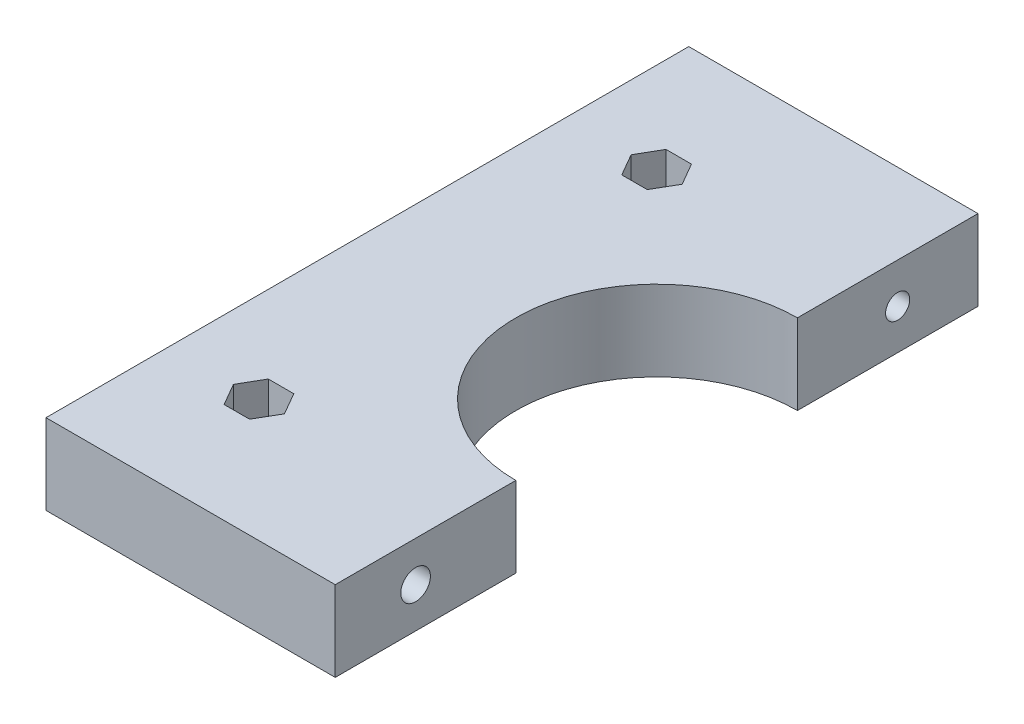
ISO-10303-21;
HEADER;
FILE_DESCRIPTION(('STEP AP214'),'2;1');
FILE_NAME('part.step','',(''),(''),'','','');
FILE_SCHEMA(('AUTOMOTIVE_DESIGN { 1 0 10303 214 1 1 1 1 }'));
ENDSEC;
DATA;
#1=APPLICATION_CONTEXT('core data for automotive mechanical design processes');
#2=APPLICATION_PROTOCOL_DEFINITION('international standard','automotive_design',2000,#1);
#3=PRODUCT_CONTEXT('',#1,'mechanical');
#4=PRODUCT('Part','Part','',(#3));
#5=PRODUCT_RELATED_PRODUCT_CATEGORY('part','',(#4));
#6=PRODUCT_DEFINITION_FORMATION('','',#4);
#7=PRODUCT_DEFINITION_CONTEXT('part definition',#1,'design');
#8=PRODUCT_DEFINITION('design','',#6,#7);
#9=PRODUCT_DEFINITION_SHAPE('','',#8);
#10=(LENGTH_UNIT() NAMED_UNIT(*) SI_UNIT(.MILLI.,.METRE.));
#11=(NAMED_UNIT(*) PLANE_ANGLE_UNIT() SI_UNIT($,.RADIAN.));
#12=(NAMED_UNIT(*) SI_UNIT($,.STERADIAN.) SOLID_ANGLE_UNIT());
#13=UNCERTAINTY_MEASURE_WITH_UNIT(LENGTH_MEASURE(1.E-05),#10,'distance_accuracy_value','');
#14=(GEOMETRIC_REPRESENTATION_CONTEXT(3) GLOBAL_UNCERTAINTY_ASSIGNED_CONTEXT((#13)) GLOBAL_UNIT_ASSIGNED_CONTEXT((#10,
#11,#12)) REPRESENTATION_CONTEXT('',''));
#15=CARTESIAN_POINT('',(0.,0.,0.));
#16=DIRECTION('',(0.,0.,1.));
#17=DIRECTION('',(1.,0.,0.));
#18=AXIS2_PLACEMENT_3D('',#15,#16,#17);
#19=CARTESIAN_POINT('',(-24.7487373415295,-5.,24.7487373415289));
#20=DIRECTION('',(0.,1.,0.));
#21=DIRECTION('',(0.,0.,1.));
#22=AXIS2_PLACEMENT_3D('',#19,#20,#21);
#23=CYLINDRICAL_SURFACE('',#22,1.5);
#24=CARTESIAN_POINT('',(-24.7487373415295,-5.,24.7487373415289));
#25=DIRECTION('',(0.,1.,0.));
#26=DIRECTION('',(0.,0.,1.));
#27=AXIS2_PLACEMENT_3D('',#24,#25,#26);
#28=CIRCLE('',#27,1.5);
#29=CARTESIAN_POINT('',(-24.7487373415295,-5.,26.2487373415289));
#30=VERTEX_POINT('',#29);
#31=EDGE_CURVE('E464',#30,#30,#28,.T.);
#32=ORIENTED_EDGE('',*,*,#31,.F.);
#33=EDGE_LOOP('',(#32));
#34=FACE_BOUND('',#33,.T.);
#35=CARTESIAN_POINT('',(-24.7487373415295,0.,24.7487373415289));
#36=DIRECTION('',(0.,1.,0.));
#37=DIRECTION('',(0.,0.,1.));
#38=AXIS2_PLACEMENT_3D('',#35,#36,#37);
#39=CIRCLE('',#38,1.5);
#40=CARTESIAN_POINT('',(-24.7487373415295,0.,26.2487373415289));
#41=VERTEX_POINT('',#40);
#42=EDGE_CURVE('E337',#41,#41,#39,.F.);
#43=ORIENTED_EDGE('',*,*,#42,.F.);
#44=EDGE_LOOP('',(#43));
#45=FACE_BOUND('',#44,.T.);
#46=ADVANCED_FACE('F47',(#34,#45),#23,.F.);
#47=CARTESIAN_POINT('',(0.,5.,0.));
#48=DIRECTION('',(0.,1.,0.));
#49=DIRECTION('',(0.,0.,1.));
#50=AXIS2_PLACEMENT_3D('',#47,#48,#49);
#51=PLANE('',#50);
#52=DIRECTION('',(1.,0.,0.));
#53=VECTOR('',#52,1.);
#54=CARTESIAN_POINT('',(0.,5.,-40.));
#55=LINE('',#54,#53);
#56=CARTESIAN_POINT('',(-36.,5.,-40.));
#57=VERTEX_POINT('',#56);
#58=CARTESIAN_POINT('',(2.79318507107451E-13,5.,-40.));
#59=VERTEX_POINT('',#58);
#60=EDGE_CURVE('E420',#57,#59,#55,.T.);
#61=ORIENTED_EDGE('',*,*,#60,.F.);
#62=DIRECTION('',(0.,0.,-1.));
#63=VECTOR('',#62,1.);
#64=CARTESIAN_POINT('',(-36.,5.,0.));
#65=LINE('',#64,#63);
#66=CARTESIAN_POINT('',(-36.,5.,40.));
#67=VERTEX_POINT('',#66);
#68=EDGE_CURVE('E424',#67,#57,#65,.T.);
#69=ORIENTED_EDGE('',*,*,#68,.F.);
#70=DIRECTION('',(1.,0.,0.));
#71=VECTOR('',#70,1.);
#72=CARTESIAN_POINT('',(0.,5.,40.));
#73=LINE('',#72,#71);
#74=CARTESIAN_POINT('',(-2.79318507107451E-13,5.,40.));
#75=VERTEX_POINT('',#74);
#76=EDGE_CURVE('E428',#67,#75,#73,.T.);
#77=ORIENTED_EDGE('',*,*,#76,.T.);
#78=DIRECTION('',(0.,0.,1.));
#79=VECTOR('',#78,1.);
#80=CARTESIAN_POINT('',(0.,5.,0.));
#81=LINE('',#80,#79);
#82=CARTESIAN_POINT('',(-1.22376420926452E-13,5.,17.525));
#83=VERTEX_POINT('',#82);
#84=EDGE_CURVE('E432',#83,#75,#81,.T.);
#85=ORIENTED_EDGE('',*,*,#84,.F.);
#86=CARTESIAN_POINT('',(0.,5.,0.));
#87=DIRECTION('',(0.,1.,0.));
#88=DIRECTION('',(0.,0.,1.));
#89=AXIS2_PLACEMENT_3D('',#86,#87,#88);
#90=CIRCLE('',#89,17.525);
#91=CARTESIAN_POINT('',(1.22376420926452E-13,5.,-17.525));
#92=VERTEX_POINT('',#91);
#93=EDGE_CURVE('E436',#92,#83,#90,.T.);
#94=ORIENTED_EDGE('',*,*,#93,.F.);
#95=DIRECTION('',(0.,0.,1.));
#96=VECTOR('',#95,1.);
#97=CARTESIAN_POINT('',(0.,5.,0.));
#98=LINE('',#97,#96);
#99=EDGE_CURVE('E440',#59,#92,#98,.T.);
#100=ORIENTED_EDGE('',*,*,#99,.F.);
#101=EDGE_LOOP('',(#61,#69,#77,#85,#94,#100));
#102=FACE_BOUND('',#101,.T.);
#103=DIRECTION('',(-0.500000000000006,0.,-0.866025403784435));
#104=VECTOR('',#103,1.);
#105=CARTESIAN_POINT('',(-21.5733108609859,5.,-24.7487373415295));
#106=LINE('',#105,#104);
#107=CARTESIAN_POINT('',(-21.5733108609859,5.,-24.7487373415295));
#108=VERTEX_POINT('',#107);
#109=CARTESIAN_POINT('',(-23.1610241012574,5.,-27.4987373415295));
#110=VERTEX_POINT('',#109);
#111=EDGE_CURVE('E379',#108,#110,#106,.T.);
#112=ORIENTED_EDGE('',*,*,#111,.F.);
#113=DIRECTION('',(0.499999999999994,0.,-0.866025403784442));
#114=VECTOR('',#113,1.);
#115=CARTESIAN_POINT('',(-23.1610241012574,5.,-21.9987373415295));
#116=LINE('',#115,#114);
#117=CARTESIAN_POINT('',(-23.1610241012574,5.,-21.9987373415295));
#118=VERTEX_POINT('',#117);
#119=EDGE_CURVE('E358',#118,#108,#116,.T.);
#120=ORIENTED_EDGE('',*,*,#119,.F.);
#121=DIRECTION('',(1.,0.,0.));
#122=VECTOR('',#121,1.);
#123=CARTESIAN_POINT('',(-26.3364505818003,5.,-21.9987373415295));
#124=LINE('',#123,#122);
#125=CARTESIAN_POINT('',(-26.3364505818003,5.,-21.9987373415295));
#126=VERTEX_POINT('',#125);
#127=EDGE_CURVE('E394',#126,#118,#124,.T.);
#128=ORIENTED_EDGE('',*,*,#127,.F.);
#129=DIRECTION('',(0.500000000000007,0.,0.866025403784435));
#130=VECTOR('',#129,1.);
#131=CARTESIAN_POINT('',(-27.9241638220718,5.,-24.7487373415294));
#132=LINE('',#131,#130);
#133=CARTESIAN_POINT('',(-27.9241638220718,5.,-24.7487373415294));
#134=VERTEX_POINT('',#133);
#135=EDGE_CURVE('E390',#134,#126,#132,.T.);
#136=ORIENTED_EDGE('',*,*,#135,.F.);
#137=DIRECTION('',(-0.499999999999994,0.,0.866025403784442));
#138=VECTOR('',#137,1.);
#139=CARTESIAN_POINT('',(-26.3364505818004,5.,-27.4987373415295));
#140=LINE('',#139,#138);
#141=CARTESIAN_POINT('',(-26.3364505818004,5.,-27.4987373415295));
#142=VERTEX_POINT('',#141);
#143=EDGE_CURVE('E386',#142,#134,#140,.T.);
#144=ORIENTED_EDGE('',*,*,#143,.F.);
#145=DIRECTION('',(-1.,0.,0.));
#146=VECTOR('',#145,1.);
#147=CARTESIAN_POINT('',(-23.1610241012574,5.,-27.4987373415295));
#148=LINE('',#147,#146);
#149=EDGE_CURVE('E382',#110,#142,#148,.T.);
#150=ORIENTED_EDGE('',*,*,#149,.F.);
#151=EDGE_LOOP('',(#112,#120,#128,#136,#144,#150));
#152=FACE_BOUND('',#151,.T.);
#153=DIRECTION('',(0.499999999999994,0.,0.866025403784442));
#154=VECTOR('',#153,1.);
#155=CARTESIAN_POINT('',(-23.1610241012574,5.,21.9987373415295));
#156=LINE('',#155,#154);
#157=CARTESIAN_POINT('',(-23.1610241012574,5.,21.9987373415295));
#158=VERTEX_POINT('',#157);
#159=CARTESIAN_POINT('',(-21.5733108609859,5.,24.7487373415295));
#160=VERTEX_POINT('',#159);
#161=EDGE_CURVE('E315',#158,#160,#156,.T.);
#162=ORIENTED_EDGE('',*,*,#161,.T.);
#163=DIRECTION('',(-0.500000000000006,0.,0.866025403784435));
#164=VECTOR('',#163,1.);
#165=CARTESIAN_POINT('',(-21.5733108609859,5.,24.7487373415295));
#166=LINE('',#165,#164);
#167=CARTESIAN_POINT('',(-23.1610241012574,5.,27.4987373415295));
#168=VERTEX_POINT('',#167);
#169=EDGE_CURVE('E293',#160,#168,#166,.T.);
#170=ORIENTED_EDGE('',*,*,#169,.T.);
#171=DIRECTION('',(-1.,0.,0.));
#172=VECTOR('',#171,1.);
#173=CARTESIAN_POINT('',(-23.1610241012574,5.,27.4987373415295));
#174=LINE('',#173,#172);
#175=CARTESIAN_POINT('',(-26.3364505818004,5.,27.4987373415295));
#176=VERTEX_POINT('',#175);
#177=EDGE_CURVE('E299',#168,#176,#174,.T.);
#178=ORIENTED_EDGE('',*,*,#177,.T.);
#179=DIRECTION('',(-0.499999999999994,0.,-0.866025403784442));
#180=VECTOR('',#179,1.);
#181=CARTESIAN_POINT('',(-26.3364505818004,5.,27.4987373415295));
#182=LINE('',#181,#180);
#183=CARTESIAN_POINT('',(-27.9241638220718,5.,24.7487373415294));
#184=VERTEX_POINT('',#183);
#185=EDGE_CURVE('E327',#176,#184,#182,.T.);
#186=ORIENTED_EDGE('',*,*,#185,.T.);
#187=DIRECTION('',(0.500000000000007,0.,-0.866025403784435));
#188=VECTOR('',#187,1.);
#189=CARTESIAN_POINT('',(-27.9241638220718,5.,24.7487373415294));
#190=LINE('',#189,#188);
#191=CARTESIAN_POINT('',(-26.3364505818003,5.,21.9987373415295));
#192=VERTEX_POINT('',#191);
#193=EDGE_CURVE('E323',#184,#192,#190,.T.);
#194=ORIENTED_EDGE('',*,*,#193,.T.);
#195=DIRECTION('',(1.,0.,0.));
#196=VECTOR('',#195,1.);
#197=CARTESIAN_POINT('',(-26.3364505818003,5.,21.9987373415295));
#198=LINE('',#197,#196);
#199=EDGE_CURVE('E319',#192,#158,#198,.T.);
#200=ORIENTED_EDGE('',*,*,#199,.T.);
#201=EDGE_LOOP('',(#162,#170,#178,#186,#194,#200));
#202=FACE_BOUND('',#201,.T.);
#203=ADVANCED_FACE('F581',(#102,#152,#202),#51,.T.);
#204=CARTESIAN_POINT('',(-24.7487373415289,-5.,-24.7487373415295));
#205=DIRECTION('',(0.,1.,0.));
#206=DIRECTION('',(0.,0.,1.));
#207=AXIS2_PLACEMENT_3D('',#204,#205,#206);
#208=CYLINDRICAL_SURFACE('',#207,1.5);
#209=CARTESIAN_POINT('',(-24.7487373415289,-5.,-24.7487373415295));
#210=DIRECTION('',(0.,1.,0.));
#211=DIRECTION('',(0.,0.,1.));
#212=AXIS2_PLACEMENT_3D('',#209,#210,#211);
#213=CIRCLE('',#212,1.5);
#214=CARTESIAN_POINT('',(-24.7487373415289,-5.,-23.2487373415295));
#215=VERTEX_POINT('',#214);
#216=EDGE_CURVE('E468',#215,#215,#213,.T.);
#217=ORIENTED_EDGE('',*,*,#216,.F.);
#218=EDGE_LOOP('',(#217));
#219=FACE_BOUND('',#218,.T.);
#220=CARTESIAN_POINT('',(-24.7487373415289,0.,-24.7487373415295));
#221=DIRECTION('',(0.,1.,0.));
#222=DIRECTION('',(0.,0.,1.));
#223=AXIS2_PLACEMENT_3D('',#220,#221,#222);
#224=CIRCLE('',#223,1.5);
#225=CARTESIAN_POINT('',(-24.7487373415289,0.,-23.2487373415295));
#226=VERTEX_POINT('',#225);
#227=EDGE_CURVE('E404',#226,#226,#224,.F.);
#228=ORIENTED_EDGE('',*,*,#227,.F.);
#229=EDGE_LOOP('',(#228));
#230=FACE_BOUND('',#229,.T.);
#231=ADVANCED_FACE('F588',(#219,#230),#208,.F.);
#232=CARTESIAN_POINT('',(0.,-5.,-40.));
#233=DIRECTION('',(0.,0.,1.));
#234=DIRECTION('',(1.,0.,0.));
#235=AXIS2_PLACEMENT_3D('',#232,#233,#234);
#236=PLANE('',#235);
#237=DIRECTION('',(0.,1.,0.));
#238=VECTOR('',#237,1.);
#239=CARTESIAN_POINT('',(-36.,-5.,-40.));
#240=LINE('',#239,#238);
#241=CARTESIAN_POINT('',(-36.,-5.,-40.));
#242=VERTEX_POINT('',#241);
#243=EDGE_CURVE('E472',#242,#57,#240,.T.);
#244=ORIENTED_EDGE('',*,*,#243,.T.);
#245=ORIENTED_EDGE('',*,*,#60,.T.);
#246=DIRECTION('',(0.,1.,0.));
#247=VECTOR('',#246,1.);
#248=CARTESIAN_POINT('',(2.79318507107451E-13,-5.,-40.));
#249=LINE('',#248,#247);
#250=CARTESIAN_POINT('',(2.79318507107451E-13,-5.,-40.));
#251=VERTEX_POINT('',#250);
#252=EDGE_CURVE('E473',#251,#59,#249,.T.);
#253=ORIENTED_EDGE('',*,*,#252,.F.);
#254=DIRECTION('',(1.,0.,0.));
#255=VECTOR('',#254,1.);
#256=CARTESIAN_POINT('',(0.,-5.,-40.));
#257=LINE('',#256,#255);
#258=EDGE_CURVE('E444',#242,#251,#257,.T.);
#259=ORIENTED_EDGE('',*,*,#258,.F.);
#260=EDGE_LOOP('',(#244,#245,#253,#259));
#261=FACE_BOUND('',#260,.T.);
#262=ADVANCED_FACE('F49',(#261),#236,.F.);
#263=CARTESIAN_POINT('',(0.,-5.,0.));
#264=DIRECTION('',(-1.,0.,0.));
#265=DIRECTION('',(0.,0.,1.));
#266=AXIS2_PLACEMENT_3D('',#263,#264,#265);
#267=PLANE('',#266);
#268=CARTESIAN_POINT('',(2.09901540593194E-13,0.,-30.));
#269=DIRECTION('',(-1.,0.,0.));
#270=DIRECTION('',(0.,0.,1.));
#271=AXIS2_PLACEMENT_3D('',#268,#269,#270);
#272=CIRCLE('',#271,1.5);
#273=CARTESIAN_POINT('',(1.99427096576664E-13,0.,-28.5));
#274=VERTEX_POINT('',#273);
#275=EDGE_CURVE('E500',#274,#274,#272,.T.);
#276=ORIENTED_EDGE('',*,*,#275,.T.);
#277=EDGE_LOOP('',(#276));
#278=FACE_BOUND('',#277,.T.);
#279=ORIENTED_EDGE('',*,*,#252,.T.);
#280=ORIENTED_EDGE('',*,*,#99,.T.);
#281=DIRECTION('',(0.,1.,0.));
#282=VECTOR('',#281,1.);
#283=CARTESIAN_POINT('',(1.22376420926452E-13,-5.,-17.525));
#284=LINE('',#283,#282);
#285=CARTESIAN_POINT('',(1.22376420926452E-13,-5.,-17.525));
#286=VERTEX_POINT('',#285);
#287=EDGE_CURVE('E476',#286,#92,#284,.T.);
#288=ORIENTED_EDGE('',*,*,#287,.F.);
#289=DIRECTION('',(0.,0.,1.));
#290=VECTOR('',#289,1.);
#291=CARTESIAN_POINT('',(0.,-5.,0.));
#292=LINE('',#291,#290);
#293=EDGE_CURVE('E461',#251,#286,#292,.T.);
#294=ORIENTED_EDGE('',*,*,#293,.F.);
#295=EDGE_LOOP('',(#279,#280,#288,#294));
#296=FACE_BOUND('',#295,.T.);
#297=ADVANCED_FACE('F596',(#278,#296),#267,.F.);
#298=CARTESIAN_POINT('',(0.,-5.,0.));
#299=DIRECTION('',(0.,1.,0.));
#300=DIRECTION('',(0.,0.,1.));
#301=AXIS2_PLACEMENT_3D('',#298,#299,#300);
#302=CYLINDRICAL_SURFACE('',#301,17.525);
#303=ORIENTED_EDGE('',*,*,#287,.T.);
#304=ORIENTED_EDGE('',*,*,#93,.T.);
#305=DIRECTION('',(0.,1.,0.));
#306=VECTOR('',#305,1.);
#307=CARTESIAN_POINT('',(-1.22376420926452E-13,-5.,17.525));
#308=LINE('',#307,#306);
#309=CARTESIAN_POINT('',(-1.22376420926452E-13,-5.,17.525));
#310=VERTEX_POINT('',#309);
#311=EDGE_CURVE('E479',#310,#83,#308,.T.);
#312=ORIENTED_EDGE('',*,*,#311,.F.);
#313=CARTESIAN_POINT('',(0.,-5.,0.));
#314=DIRECTION('',(0.,1.,0.));
#315=DIRECTION('',(0.,0.,1.));
#316=AXIS2_PLACEMENT_3D('',#313,#314,#315);
#317=CIRCLE('',#316,17.525);
#318=EDGE_CURVE('E458',#286,#310,#317,.T.);
#319=ORIENTED_EDGE('',*,*,#318,.F.);
#320=EDGE_LOOP('',(#303,#304,#312,#319));
#321=FACE_BOUND('',#320,.T.);
#322=ADVANCED_FACE('F599',(#321),#302,.F.);
#323=CARTESIAN_POINT('',(0.,-5.,0.));
#324=DIRECTION('',(-1.,0.,0.));
#325=DIRECTION('',(0.,0.,1.));
#326=AXIS2_PLACEMENT_3D('',#323,#324,#325);
#327=PLANE('',#326);
#328=CARTESIAN_POINT('',(-2.09901540593194E-13,0.,30.));
#329=DIRECTION('',(-1.,0.,0.));
#330=DIRECTION('',(0.,0.,1.));
#331=AXIS2_PLACEMENT_3D('',#328,#329,#330);
#332=CIRCLE('',#331,1.84326133668046);
#333=CARTESIAN_POINT('',(-2.22772965712455E-13,0.,31.8432613366805));
#334=VERTEX_POINT('',#333);
#335=EDGE_CURVE('E230',#334,#334,#332,.T.);
#336=ORIENTED_EDGE('',*,*,#335,.T.);
#337=EDGE_LOOP('',(#336));
#338=FACE_BOUND('',#337,.T.);
#339=ORIENTED_EDGE('',*,*,#311,.T.);
#340=ORIENTED_EDGE('',*,*,#84,.T.);
#341=DIRECTION('',(0.,1.,0.));
#342=VECTOR('',#341,1.);
#343=CARTESIAN_POINT('',(-2.79318507107451E-13,-5.,40.));
#344=LINE('',#343,#342);
#345=CARTESIAN_POINT('',(-2.79318507107451E-13,-5.,40.));
#346=VERTEX_POINT('',#345);
#347=EDGE_CURVE('E482',#346,#75,#344,.T.);
#348=ORIENTED_EDGE('',*,*,#347,.F.);
#349=DIRECTION('',(0.,0.,1.));
#350=VECTOR('',#349,1.);
#351=CARTESIAN_POINT('',(0.,-5.,0.));
#352=LINE('',#351,#350);
#353=EDGE_CURVE('E455',#310,#346,#352,.T.);
#354=ORIENTED_EDGE('',*,*,#353,.F.);
#355=EDGE_LOOP('',(#339,#340,#348,#354));
#356=FACE_BOUND('',#355,.T.);
#357=ADVANCED_FACE('F602',(#338,#356),#327,.F.);
#358=CARTESIAN_POINT('',(0.,-5.,40.));
#359=DIRECTION('',(0.,0.,1.));
#360=DIRECTION('',(1.,0.,0.));
#361=AXIS2_PLACEMENT_3D('',#358,#359,#360);
#362=PLANE('',#361);
#363=ORIENTED_EDGE('',*,*,#347,.T.);
#364=ORIENTED_EDGE('',*,*,#76,.F.);
#365=DIRECTION('',(0.,1.,0.));
#366=VECTOR('',#365,1.);
#367=CARTESIAN_POINT('',(-36.,-5.,40.));
#368=LINE('',#367,#366);
#369=CARTESIAN_POINT('',(-36.,-5.,40.));
#370=VERTEX_POINT('',#369);
#371=EDGE_CURVE('E485',#370,#67,#368,.T.);
#372=ORIENTED_EDGE('',*,*,#371,.F.);
#373=DIRECTION('',(1.,0.,0.));
#374=VECTOR('',#373,1.);
#375=CARTESIAN_POINT('',(0.,-5.,40.));
#376=LINE('',#375,#374);
#377=EDGE_CURVE('E451',#370,#346,#376,.T.);
#378=ORIENTED_EDGE('',*,*,#377,.T.);
#379=EDGE_LOOP('',(#363,#364,#372,#378));
#380=FACE_BOUND('',#379,.T.);
#381=ADVANCED_FACE('F606',(#380),#362,.T.);
#382=CARTESIAN_POINT('',(-36.,-5.,0.));
#383=DIRECTION('',(1.,0.,0.));
#384=DIRECTION('',(0.,0.,-1.));
#385=AXIS2_PLACEMENT_3D('',#382,#383,#384);
#386=PLANE('',#385);
#387=CARTESIAN_POINT('',(-36.,0.,-30.));
#388=DIRECTION('',(-1.,0.,0.));
#389=DIRECTION('',(0.,0.,1.));
#390=AXIS2_PLACEMENT_3D('',#387,#388,#389);
#391=CIRCLE('',#390,2.5);
#392=CARTESIAN_POINT('',(-36.,0.,-27.5));
#393=VERTEX_POINT('',#392);
#394=EDGE_CURVE('E248',#393,#393,#391,.T.);
#395=ORIENTED_EDGE('',*,*,#394,.F.);
#396=EDGE_LOOP('',(#395));
#397=FACE_BOUND('',#396,.T.);
#398=DIRECTION('',(0.,0.00176809729575302,-0.999998436914755));
#399=VECTOR('',#398,1.);
#400=CARTESIAN_POINT('',(-36.,2.74749068907875,31.5925730261037));
#401=LINE('',#400,#399);
#402=CARTESIAN_POINT('',(-36.,2.74749068907875,31.5925730261037));
#403=VERTEX_POINT('',#402);
#404=CARTESIAN_POINT('',(-36.,2.75310515205186,28.417151509023));
#405=VERTEX_POINT('',#404);
#406=EDGE_CURVE('E246',#403,#405,#401,.T.);
#407=ORIENTED_EDGE('',*,*,#406,.F.);
#408=DIRECTION('',(0.,0.866908098760784,-0.498468001282894));
#409=VECTOR('',#408,1.);
#410=CARTESIAN_POINT('',(-36.,-0.00531224392338013,33.1754215170807));
#411=LINE('',#410,#409);
#412=CARTESIAN_POINT('',(-36.,-0.00531224392338013,33.1754215170807));
#413=VERTEX_POINT('',#412);
#414=EDGE_CURVE('E65',#413,#403,#411,.T.);
#415=ORIENTED_EDGE('',*,*,#414,.F.);
#416=DIRECTION('',(0.,0.865140001465032,0.501530435631862));
#417=VECTOR('',#416,1.);
#418=CARTESIAN_POINT('',(-36.,-2.75250071395239,31.582848490977));
#419=LINE('',#418,#417);
#420=CARTESIAN_POINT('',(-36.,-2.75250071395239,31.582848490977));
#421=VERTEX_POINT('',#420);
#422=EDGE_CURVE('E233',#421,#413,#419,.T.);
#423=ORIENTED_EDGE('',*,*,#422,.F.);
#424=DIRECTION('',(0.,-0.00176809729575275,0.999998436914755));
#425=VECTOR('',#424,1.);
#426=CARTESIAN_POINT('',(-36.,-2.74688625097928,28.4074269738964));
#427=LINE('',#426,#425);
#428=CARTESIAN_POINT('',(-36.,-2.74688625097928,28.4074269738964));
#429=VERTEX_POINT('',#428);
#430=EDGE_CURVE('E239',#429,#421,#427,.T.);
#431=ORIENTED_EDGE('',*,*,#430,.F.);
#432=DIRECTION('',(0.,-0.866908098760785,0.498468001282893));
#433=VECTOR('',#432,1.);
#434=CARTESIAN_POINT('',(-36.,0.00591668202284783,26.8245784829193));
#435=LINE('',#434,#433);
#436=CARTESIAN_POINT('',(-36.,0.00591668202284783,26.8245784829193));
#437=VERTEX_POINT('',#436);
#438=EDGE_CURVE('E533',#437,#429,#435,.T.);
#439=ORIENTED_EDGE('',*,*,#438,.F.);
#440=DIRECTION('',(0.,-0.865140001465032,-0.501530435631862));
#441=VECTOR('',#440,1.);
#442=CARTESIAN_POINT('',(-36.,2.75310515205186,28.417151509023));
#443=LINE('',#442,#441);
#444=EDGE_CURVE('E255',#405,#437,#443,.T.);
#445=ORIENTED_EDGE('',*,*,#444,.F.);
#446=EDGE_LOOP('',(#407,#415,#423,#431,#439,#445));
#447=FACE_BOUND('',#446,.T.);
#448=ORIENTED_EDGE('',*,*,#371,.T.);
#449=ORIENTED_EDGE('',*,*,#68,.T.);
#450=ORIENTED_EDGE('',*,*,#243,.F.);
#451=DIRECTION('',(0.,0.,-1.));
#452=VECTOR('',#451,1.);
#453=CARTESIAN_POINT('',(-36.,-5.,0.));
#454=LINE('',#453,#452);
#455=EDGE_CURVE('E448',#370,#242,#454,.T.);
#456=ORIENTED_EDGE('',*,*,#455,.F.);
#457=EDGE_LOOP('',(#448,#449,#450,#456));
#458=FACE_BOUND('',#457,.T.);
#459=ADVANCED_FACE('F242',(#397,#447,#458),#386,.F.);
#460=CARTESIAN_POINT('',(0.,-5.,0.));
#461=DIRECTION('',(0.,1.,0.));
#462=DIRECTION('',(0.,0.,1.));
#463=AXIS2_PLACEMENT_3D('',#460,#461,#462);
#464=PLANE('',#463);
#465=ORIENTED_EDGE('',*,*,#258,.T.);
#466=ORIENTED_EDGE('',*,*,#293,.T.);
#467=ORIENTED_EDGE('',*,*,#318,.T.);
#468=ORIENTED_EDGE('',*,*,#353,.T.);
#469=ORIENTED_EDGE('',*,*,#377,.F.);
#470=ORIENTED_EDGE('',*,*,#455,.T.);
#471=EDGE_LOOP('',(#465,#466,#467,#468,#469,#470));
#472=FACE_BOUND('',#471,.T.);
#473=ORIENTED_EDGE('',*,*,#31,.T.);
#474=EDGE_LOOP('',(#473));
#475=FACE_BOUND('',#474,.T.);
#476=ORIENTED_EDGE('',*,*,#216,.T.);
#477=EDGE_LOOP('',(#476));
#478=FACE_BOUND('',#477,.T.);
#479=ADVANCED_FACE('F611',(#472,#475,#478),#464,.F.);
#480=CARTESIAN_POINT('',(0.,0.,0.));
#481=DIRECTION('',(0.,1.,0.));
#482=DIRECTION('',(0.,0.,1.));
#483=AXIS2_PLACEMENT_3D('',#480,#481,#482);
#484=PLANE('',#483);
#485=DIRECTION('',(-0.500000000000006,0.,-0.866025403784435));
#486=VECTOR('',#485,1.);
#487=CARTESIAN_POINT('',(-21.5733108609859,0.,-24.7487373415295));
#488=LINE('',#487,#486);
#489=CARTESIAN_POINT('',(-21.5733108609859,0.,-24.7487373415295));
#490=VERTEX_POINT('',#489);
#491=CARTESIAN_POINT('',(-23.1610241012574,0.,-27.4987373415295));
#492=VERTEX_POINT('',#491);
#493=EDGE_CURVE('E353',#490,#492,#488,.T.);
#494=ORIENTED_EDGE('',*,*,#493,.T.);
#495=DIRECTION('',(-1.,0.,0.));
#496=VECTOR('',#495,1.);
#497=CARTESIAN_POINT('',(-23.1610241012574,0.,-27.4987373415295));
#498=LINE('',#497,#496);
#499=CARTESIAN_POINT('',(-26.3364505818004,0.,-27.4987373415295));
#500=VERTEX_POINT('',#499);
#501=EDGE_CURVE('E357',#492,#500,#498,.T.);
#502=ORIENTED_EDGE('',*,*,#501,.T.);
#503=DIRECTION('',(-0.499999999999994,0.,0.866025403784442));
#504=VECTOR('',#503,1.);
#505=CARTESIAN_POINT('',(-26.3364505818004,0.,-27.4987373415295));
#506=LINE('',#505,#504);
#507=CARTESIAN_POINT('',(-27.9241638220718,0.,-24.7487373415294));
#508=VERTEX_POINT('',#507);
#509=EDGE_CURVE('E362',#500,#508,#506,.T.);
#510=ORIENTED_EDGE('',*,*,#509,.T.);
#511=DIRECTION('',(0.500000000000007,0.,0.866025403784435));
#512=VECTOR('',#511,1.);
#513=CARTESIAN_POINT('',(-27.9241638220718,0.,-24.7487373415294));
#514=LINE('',#513,#512);
#515=CARTESIAN_POINT('',(-26.3364505818003,0.,-21.9987373415295));
#516=VERTEX_POINT('',#515);
#517=EDGE_CURVE('E366',#508,#516,#514,.T.);
#518=ORIENTED_EDGE('',*,*,#517,.T.);
#519=DIRECTION('',(1.,0.,0.));
#520=VECTOR('',#519,1.);
#521=CARTESIAN_POINT('',(-26.3364505818003,0.,-21.9987373415295));
#522=LINE('',#521,#520);
#523=CARTESIAN_POINT('',(-23.1610241012574,0.,-21.9987373415295));
#524=VERTEX_POINT('',#523);
#525=EDGE_CURVE('E370',#516,#524,#522,.T.);
#526=ORIENTED_EDGE('',*,*,#525,.T.);
#527=DIRECTION('',(0.499999999999994,0.,-0.866025403784442));
#528=VECTOR('',#527,1.);
#529=CARTESIAN_POINT('',(-23.1610241012574,0.,-21.9987373415295));
#530=LINE('',#529,#528);
#531=EDGE_CURVE('E374',#524,#490,#530,.T.);
#532=ORIENTED_EDGE('',*,*,#531,.T.);
#533=EDGE_LOOP('',(#494,#502,#510,#518,#526,#532));
#534=FACE_BOUND('',#533,.T.);
#535=ORIENTED_EDGE('',*,*,#227,.T.);
#536=EDGE_LOOP('',(#535));
#537=FACE_BOUND('',#536,.T.);
#538=ADVANCED_FACE('F618',(#534,#537),#484,.T.);
#539=CARTESIAN_POINT('',(-21.5733108609859,0.,-24.7487373415295));
#540=DIRECTION('',(0.866025403784435,0.,-0.500000000000006));
#541=DIRECTION('',(-0.500000000000006,0.,-0.866025403784435));
#542=AXIS2_PLACEMENT_3D('',#539,#540,#541);
#543=PLANE('',#542);
#544=ORIENTED_EDGE('',*,*,#111,.T.);
#545=DIRECTION('',(0.,1.,0.));
#546=VECTOR('',#545,1.);
#547=CARTESIAN_POINT('',(-23.1610241012574,0.,-27.4987373415295));
#548=LINE('',#547,#546);
#549=EDGE_CURVE('E378',#492,#110,#548,.T.);
#550=ORIENTED_EDGE('',*,*,#549,.F.);
#551=ORIENTED_EDGE('',*,*,#493,.F.);
#552=DIRECTION('',(0.,1.,0.));
#553=VECTOR('',#552,1.);
#554=CARTESIAN_POINT('',(-21.5733108609859,0.,-24.7487373415295));
#555=LINE('',#554,#553);
#556=EDGE_CURVE('E401',#490,#108,#555,.T.);
#557=ORIENTED_EDGE('',*,*,#556,.T.);
#558=EDGE_LOOP('',(#544,#550,#551,#557));
#559=FACE_BOUND('',#558,.T.);
#560=ADVANCED_FACE('F658',(#559),#543,.F.);
#561=CARTESIAN_POINT('',(-23.1610241012574,0.,-21.9987373415295));
#562=DIRECTION('',(0.866025403784442,0.,0.499999999999994));
#563=DIRECTION('',(0.499999999999994,0.,-0.866025403784442));
#564=AXIS2_PLACEMENT_3D('',#561,#562,#563);
#565=PLANE('',#564);
#566=ORIENTED_EDGE('',*,*,#119,.T.);
#567=ORIENTED_EDGE('',*,*,#556,.F.);
#568=ORIENTED_EDGE('',*,*,#531,.F.);
#569=DIRECTION('',(0.,1.,0.));
#570=VECTOR('',#569,1.);
#571=CARTESIAN_POINT('',(-23.1610241012574,0.,-21.9987373415295));
#572=LINE('',#571,#570);
#573=EDGE_CURVE('E405',#524,#118,#572,.T.);
#574=ORIENTED_EDGE('',*,*,#573,.T.);
#575=EDGE_LOOP('',(#566,#567,#568,#574));
#576=FACE_BOUND('',#575,.T.);
#577=ADVANCED_FACE('F660',(#576),#565,.F.);
#578=CARTESIAN_POINT('',(-26.3364505818003,0.,-21.9987373415295));
#579=DIRECTION('',(0.,0.,1.));
#580=DIRECTION('',(1.,0.,0.));
#581=AXIS2_PLACEMENT_3D('',#578,#579,#580);
#582=PLANE('',#581);
#583=ORIENTED_EDGE('',*,*,#127,.T.);
#584=ORIENTED_EDGE('',*,*,#573,.F.);
#585=ORIENTED_EDGE('',*,*,#525,.F.);
#586=DIRECTION('',(0.,1.,0.));
#587=VECTOR('',#586,1.);
#588=CARTESIAN_POINT('',(-26.3364505818003,0.,-21.9987373415295));
#589=LINE('',#588,#587);
#590=EDGE_CURVE('E408',#516,#126,#589,.T.);
#591=ORIENTED_EDGE('',*,*,#590,.T.);
#592=EDGE_LOOP('',(#583,#584,#585,#591));
#593=FACE_BOUND('',#592,.T.);
#594=ADVANCED_FACE('F663',(#593),#582,.F.);
#595=CARTESIAN_POINT('',(-27.9241638220718,0.,-24.7487373415294));
#596=DIRECTION('',(-0.866025403784435,0.,0.500000000000007));
#597=DIRECTION('',(0.500000000000007,0.,0.866025403784435));
#598=AXIS2_PLACEMENT_3D('',#595,#596,#597);
#599=PLANE('',#598);
#600=ORIENTED_EDGE('',*,*,#135,.T.);
#601=ORIENTED_EDGE('',*,*,#590,.F.);
#602=ORIENTED_EDGE('',*,*,#517,.F.);
#603=DIRECTION('',(0.,1.,0.));
#604=VECTOR('',#603,1.);
#605=CARTESIAN_POINT('',(-27.9241638220718,0.,-24.7487373415294));
#606=LINE('',#605,#604);
#607=EDGE_CURVE('E411',#508,#134,#606,.T.);
#608=ORIENTED_EDGE('',*,*,#607,.T.);
#609=EDGE_LOOP('',(#600,#601,#602,#608));
#610=FACE_BOUND('',#609,.T.);
#611=ADVANCED_FACE('F667',(#610),#599,.F.);
#612=CARTESIAN_POINT('',(-26.3364505818004,0.,-27.4987373415295));
#613=DIRECTION('',(-0.866025403784442,0.,-0.499999999999994));
#614=DIRECTION('',(-0.499999999999994,0.,0.866025403784442));
#615=AXIS2_PLACEMENT_3D('',#612,#613,#614);
#616=PLANE('',#615);
#617=ORIENTED_EDGE('',*,*,#143,.T.);
#618=ORIENTED_EDGE('',*,*,#607,.F.);
#619=ORIENTED_EDGE('',*,*,#509,.F.);
#620=DIRECTION('',(0.,1.,0.));
#621=VECTOR('',#620,1.);
#622=CARTESIAN_POINT('',(-26.3364505818004,0.,-27.4987373415295));
#623=LINE('',#622,#621);
#624=EDGE_CURVE('E414',#500,#142,#623,.T.);
#625=ORIENTED_EDGE('',*,*,#624,.T.);
#626=EDGE_LOOP('',(#617,#618,#619,#625));
#627=FACE_BOUND('',#626,.T.);
#628=ADVANCED_FACE('F671',(#627),#616,.F.);
#629=CARTESIAN_POINT('',(-23.1610241012574,0.,-27.4987373415295));
#630=DIRECTION('',(0.,0.,-1.));
#631=DIRECTION('',(-1.,0.,0.));
#632=AXIS2_PLACEMENT_3D('',#629,#630,#631);
#633=PLANE('',#632);
#634=ORIENTED_EDGE('',*,*,#149,.T.);
#635=ORIENTED_EDGE('',*,*,#624,.F.);
#636=ORIENTED_EDGE('',*,*,#501,.F.);
#637=ORIENTED_EDGE('',*,*,#549,.T.);
#638=EDGE_LOOP('',(#634,#635,#636,#637));
#639=FACE_BOUND('',#638,.T.);
#640=ADVANCED_FACE('F675',(#639),#633,.F.);
#641=CARTESIAN_POINT('',(0.,0.,0.));
#642=DIRECTION('',(0.,1.,0.));
#643=DIRECTION('',(0.,0.,-1.));
#644=AXIS2_PLACEMENT_3D('',#641,#642,#643);
#645=PLANE('',#644);
#646=DIRECTION('',(-1.,0.,0.));
#647=VECTOR('',#646,1.);
#648=CARTESIAN_POINT('',(0.,0.,26.827980546721));
#649=LINE('',#648,#647);
#650=CARTESIAN_POINT('',(-22.773762485214,0.,26.827980546721));
#651=VERTEX_POINT('',#650);
#652=CARTESIAN_POINT('',(-26.7237121978438,0.,26.827980546721));
#653=VERTEX_POINT('',#652);
#654=EDGE_CURVE('E287',#651,#653,#649,.T.);
#655=ORIENTED_EDGE('',*,*,#654,.F.);
#656=DIRECTION('',(-0.500000000000006,0.,0.866025403784435));
#657=VECTOR('',#656,1.);
#658=CARTESIAN_POINT('',(-21.5733108609859,0.,24.7487373415295));
#659=LINE('',#658,#657);
#660=CARTESIAN_POINT('',(-21.5733108609859,0.,24.7487373415295));
#661=VERTEX_POINT('',#660);
#662=EDGE_CURVE('E294',#661,#651,#659,.T.);
#663=ORIENTED_EDGE('',*,*,#662,.F.);
#664=DIRECTION('',(0.499999999999994,0.,0.866025403784442));
#665=VECTOR('',#664,1.);
#666=CARTESIAN_POINT('',(-23.1610241012574,0.,21.9987373415295));
#667=LINE('',#666,#665);
#668=CARTESIAN_POINT('',(-23.1610241012574,0.,21.9987373415295));
#669=VERTEX_POINT('',#668);
#670=EDGE_CURVE('E298',#669,#661,#667,.T.);
#671=ORIENTED_EDGE('',*,*,#670,.F.);
#672=DIRECTION('',(1.,0.,0.));
#673=VECTOR('',#672,1.);
#674=CARTESIAN_POINT('',(-26.3364505818003,0.,21.9987373415295));
#675=LINE('',#674,#673);
#676=CARTESIAN_POINT('',(-26.3364505818003,0.,21.9987373415295));
#677=VERTEX_POINT('',#676);
#678=EDGE_CURVE('E302',#677,#669,#675,.T.);
#679=ORIENTED_EDGE('',*,*,#678,.F.);
#680=DIRECTION('',(0.500000000000007,0.,-0.866025403784435));
#681=VECTOR('',#680,1.);
#682=CARTESIAN_POINT('',(-27.9241638220718,0.,24.7487373415294));
#683=LINE('',#682,#681);
#684=CARTESIAN_POINT('',(-27.9241638220718,0.,24.7487373415294));
#685=VERTEX_POINT('',#684);
#686=EDGE_CURVE('E305',#685,#677,#683,.T.);
#687=ORIENTED_EDGE('',*,*,#686,.F.);
#688=DIRECTION('',(-0.499999999999994,0.,-0.866025403784442));
#689=VECTOR('',#688,1.);
#690=CARTESIAN_POINT('',(-26.3364505818004,0.,27.4987373415295));
#691=LINE('',#690,#689);
#692=EDGE_CURVE('E308',#653,#685,#691,.T.);
#693=ORIENTED_EDGE('',*,*,#692,.F.);
#694=EDGE_LOOP('',(#655,#663,#671,#679,#687,#693));
#695=FACE_BOUND('',#694,.T.);
#696=ORIENTED_EDGE('',*,*,#42,.T.);
#697=EDGE_LOOP('',(#696));
#698=FACE_BOUND('',#697,.T.);
#699=ADVANCED_FACE('F655',(#695,#698),#645,.T.);
#700=CARTESIAN_POINT('',(-21.5733108609859,0.,24.7487373415295));
#701=DIRECTION('',(-0.866025403784435,0.,-0.500000000000006));
#702=DIRECTION('',(-0.500000000000006,0.,0.866025403784435));
#703=AXIS2_PLACEMENT_3D('',#700,#701,#702);
#704=PLANE('',#703);
#705=DIRECTION('',(-0.276565390201842,-0.833094436285598,0.479025307444694));
#706=VECTOR('',#705,1.);
#707=CARTESIAN_POINT('',(-22.4064799168524,1.10636064774199,26.1918284775843));
#708=LINE('',#707,#706);
#709=CARTESIAN_POINT('',(-22.7717983027623,0.00591668202284718,26.8245784829193));
#710=VERTEX_POINT('',#709);
#711=EDGE_CURVE('E290',#710,#651,#708,.T.);
#712=ORIENTED_EDGE('',*,*,#711,.F.);
#713=DIRECTION('',(0.27813345158951,-0.831003689779793,-0.481741269437522));
#714=VECTOR('',#713,1.);
#715=CARTESIAN_POINT('',(-22.3995793746346,-1.1061944319488,26.1798763878634));
#716=LINE('',#715,#714);
#717=CARTESIAN_POINT('',(-23.1610241012574,1.16884071312544,27.4987373415295));
#718=VERTEX_POINT('',#717);
#719=EDGE_CURVE('E284',#718,#710,#716,.T.);
#720=ORIENTED_EDGE('',*,*,#719,.F.);
#721=DIRECTION('',(0.,1.,0.));
#722=VECTOR('',#721,1.);
#723=CARTESIAN_POINT('',(-23.1610241012574,0.,27.4987373415295));
#724=LINE('',#723,#722);
#725=EDGE_CURVE('E334',#718,#168,#724,.T.);
#726=ORIENTED_EDGE('',*,*,#725,.T.);
#727=ORIENTED_EDGE('',*,*,#169,.F.);
#728=DIRECTION('',(0.,1.,0.));
#729=VECTOR('',#728,1.);
#730=CARTESIAN_POINT('',(-21.5733108609859,0.,24.7487373415295));
#731=LINE('',#730,#729);
#732=EDGE_CURVE('E311',#661,#160,#731,.T.);
#733=ORIENTED_EDGE('',*,*,#732,.F.);
#734=ORIENTED_EDGE('',*,*,#662,.T.);
#735=EDGE_LOOP('',(#712,#720,#726,#727,#733,#734));
#736=FACE_BOUND('',#735,.T.);
#737=ADVANCED_FACE('F561',(#736),#704,.T.);
#738=CARTESIAN_POINT('',(-23.1610241012574,0.,27.4987373415295));
#739=DIRECTION('',(0.,0.,-1.));
#740=DIRECTION('',(-1.,0.,0.));
#741=AXIS2_PLACEMENT_3D('',#738,#739,#740);
#742=PLANE('',#741);
#743=DIRECTION('',(1.,0.,0.));
#744=VECTOR('',#743,1.);
#745=CARTESIAN_POINT('',(-23.1610241012574,1.16884071312544,27.4987373415295));
#746=LINE('',#745,#744);
#747=CARTESIAN_POINT('',(-26.3364505818004,1.16884071312538,27.4987373415295));
#748=VERTEX_POINT('',#747);
#749=EDGE_CURVE('E281',#748,#718,#746,.T.);
#750=ORIENTED_EDGE('',*,*,#749,.F.);
#751=DIRECTION('',(0.,1.,0.));
#752=VECTOR('',#751,1.);
#753=CARTESIAN_POINT('',(-26.3364505818004,0.,27.4987373415295));
#754=LINE('',#753,#752);
#755=EDGE_CURVE('E338',#748,#176,#754,.T.);
#756=ORIENTED_EDGE('',*,*,#755,.T.);
#757=ORIENTED_EDGE('',*,*,#177,.F.);
#758=ORIENTED_EDGE('',*,*,#725,.F.);
#759=EDGE_LOOP('',(#750,#756,#757,#758));
#760=FACE_BOUND('',#759,.T.);
#761=ADVANCED_FACE('F557',(#760),#742,.T.);
#762=CARTESIAN_POINT('',(-26.3364505818004,0.,27.4987373415295));
#763=DIRECTION('',(0.866025403784442,0.,-0.499999999999994));
#764=DIRECTION('',(-0.499999999999994,0.,-0.866025403784442));
#765=AXIS2_PLACEMENT_3D('',#762,#763,#764);
#766=PLANE('',#765);
#767=DIRECTION('',(-0.276565390201834,0.8330944362856,-0.479025307444696));
#768=VECTOR('',#767,1.);
#769=CARTESIAN_POINT('',(-26.6052280889487,-0.356908186655956,27.0332010432168));
#770=LINE('',#769,#768);
#771=CARTESIAN_POINT('',(-26.7256763802955,0.00591668202284788,26.8245784829193));
#772=VERTEX_POINT('',#771);
#773=EDGE_CURVE('E11',#653,#772,#770,.T.);
#774=ORIENTED_EDGE('',*,*,#773,.F.);
#775=ORIENTED_EDGE('',*,*,#692,.T.);
#776=DIRECTION('',(0.,1.,0.));
#777=VECTOR('',#776,1.);
#778=CARTESIAN_POINT('',(-27.9241638220718,0.,24.7487373415294));
#779=LINE('',#778,#777);
#780=EDGE_CURVE('E341',#685,#184,#779,.T.);
#781=ORIENTED_EDGE('',*,*,#780,.T.);
#782=ORIENTED_EDGE('',*,*,#185,.F.);
#783=ORIENTED_EDGE('',*,*,#755,.F.);
#784=DIRECTION('',(0.278133451589502,0.831003689779795,0.481741269437523));
#785=VECTOR('',#784,1.);
#786=CARTESIAN_POINT('',(-26.6066046476033,0.361677733597715,27.0308167736874));
#787=LINE('',#786,#785);
#788=EDGE_CURVE('E57',#772,#748,#787,.T.);
#789=ORIENTED_EDGE('',*,*,#788,.F.);
#790=EDGE_LOOP('',(#774,#775,#781,#782,#783,#789));
#791=FACE_BOUND('',#790,.T.);
#792=ADVANCED_FACE('F551',(#791),#766,.T.);
#793=CARTESIAN_POINT('',(-27.9241638220718,0.,24.7487373415294));
#794=DIRECTION('',(0.866025403784435,0.,0.500000000000007));
#795=DIRECTION('',(0.500000000000007,0.,-0.866025403784435));
#796=AXIS2_PLACEMENT_3D('',#793,#794,#795);
#797=PLANE('',#796);
#798=ORIENTED_EDGE('',*,*,#193,.F.);
#799=ORIENTED_EDGE('',*,*,#780,.F.);
#800=ORIENTED_EDGE('',*,*,#686,.T.);
#801=DIRECTION('',(0.,1.,0.));
#802=VECTOR('',#801,1.);
#803=CARTESIAN_POINT('',(-26.3364505818003,0.,21.9987373415295));
#804=LINE('',#803,#802);
#805=EDGE_CURVE('E344',#677,#192,#804,.T.);
#806=ORIENTED_EDGE('',*,*,#805,.T.);
#807=EDGE_LOOP('',(#798,#799,#800,#806));
#808=FACE_BOUND('',#807,.T.);
#809=ADVANCED_FACE('F647',(#808),#797,.T.);
#810=CARTESIAN_POINT('',(-26.3364505818003,0.,21.9987373415295));
#811=DIRECTION('',(0.,0.,1.));
#812=DIRECTION('',(1.,0.,0.));
#813=AXIS2_PLACEMENT_3D('',#810,#811,#812);
#814=PLANE('',#813);
#815=ORIENTED_EDGE('',*,*,#199,.F.);
#816=ORIENTED_EDGE('',*,*,#805,.F.);
#817=ORIENTED_EDGE('',*,*,#678,.T.);
#818=DIRECTION('',(0.,1.,0.));
#819=VECTOR('',#818,1.);
#820=CARTESIAN_POINT('',(-23.1610241012574,0.,21.9987373415295));
#821=LINE('',#820,#819);
#822=EDGE_CURVE('E347',#669,#158,#821,.T.);
#823=ORIENTED_EDGE('',*,*,#822,.T.);
#824=EDGE_LOOP('',(#815,#816,#817,#823));
#825=FACE_BOUND('',#824,.T.);
#826=ADVANCED_FACE('F641',(#825),#814,.T.);
#827=CARTESIAN_POINT('',(-23.1610241012574,0.,21.9987373415295));
#828=DIRECTION('',(-0.866025403784442,0.,0.499999999999994));
#829=DIRECTION('',(0.499999999999994,0.,0.866025403784442));
#830=AXIS2_PLACEMENT_3D('',#827,#828,#829);
#831=PLANE('',#830);
#832=ORIENTED_EDGE('',*,*,#161,.F.);
#833=ORIENTED_EDGE('',*,*,#822,.F.);
#834=ORIENTED_EDGE('',*,*,#670,.T.);
#835=ORIENTED_EDGE('',*,*,#732,.T.);
#836=EDGE_LOOP('',(#832,#833,#834,#835));
#837=FACE_BOUND('',#836,.T.);
#838=ADVANCED_FACE('F634',(#837),#831,.T.);
#839=CARTESIAN_POINT('',(-6.,-0.00531224392338013,33.1754215170807));
#840=DIRECTION('',(0.,0.498468001282893,0.866908098760784));
#841=DIRECTION('',(0.,-0.866908098760784,0.498468001282894));
#842=AXIS2_PLACEMENT_3D('',#839,#840,#841);
#843=PLANE('',#842);
#844=ORIENTED_EDGE('',*,*,#414,.T.);
#845=DIRECTION('',(-1.,0.,0.));
#846=VECTOR('',#845,1.);
#847=CARTESIAN_POINT('',(-6.,2.74749068907875,31.5925730261037));
#848=LINE('',#847,#846);
#849=CARTESIAN_POINT('',(-6.,2.74749068907875,31.5925730261037));
#850=VERTEX_POINT('',#849);
#851=EDGE_CURVE('E263',#850,#403,#848,.T.);
#852=ORIENTED_EDGE('',*,*,#851,.F.);
#853=DIRECTION('',(0.,0.866908098760784,-0.498468001282894));
#854=VECTOR('',#853,1.);
#855=CARTESIAN_POINT('',(-6.,-0.00531224392338013,33.1754215170807));
#856=LINE('',#855,#854);
#857=CARTESIAN_POINT('',(-6.,-0.00531224392338013,33.1754215170807));
#858=VERTEX_POINT('',#857);
#859=EDGE_CURVE('E224',#858,#850,#856,.T.);
#860=ORIENTED_EDGE('',*,*,#859,.F.);
#861=DIRECTION('',(-1.,0.,0.));
#862=VECTOR('',#861,1.);
#863=CARTESIAN_POINT('',(-6.,-0.00531224392338013,33.1754215170807));
#864=LINE('',#863,#862);
#865=EDGE_CURVE('E220',#858,#413,#864,.T.);
#866=ORIENTED_EDGE('',*,*,#865,.T.);
#867=EDGE_LOOP('',(#844,#852,#860,#866));
#868=FACE_BOUND('',#867,.T.);
#869=ADVANCED_FACE('F222',(#868),#843,.F.);
#870=CARTESIAN_POINT('',(-6.,-2.75250071395239,31.582848490977));
#871=DIRECTION('',(0.,-0.501530435631862,0.865140001465032));
#872=DIRECTION('',(0.,-0.865140001465032,-0.501530435631862));
#873=AXIS2_PLACEMENT_3D('',#870,#871,#872);
#874=PLANE('',#873);
#875=ORIENTED_EDGE('',*,*,#422,.T.);
#876=ORIENTED_EDGE('',*,*,#865,.F.);
#877=DIRECTION('',(0.,0.865140001465032,0.501530435631862));
#878=VECTOR('',#877,1.);
#879=CARTESIAN_POINT('',(-6.,-2.75250071395239,31.582848490977));
#880=LINE('',#879,#878);
#881=CARTESIAN_POINT('',(-6.,-2.75250071395239,31.582848490977));
#882=VERTEX_POINT('',#881);
#883=EDGE_CURVE('E259',#882,#858,#880,.T.);
#884=ORIENTED_EDGE('',*,*,#883,.F.);
#885=DIRECTION('',(-1.,0.,0.));
#886=VECTOR('',#885,1.);
#887=CARTESIAN_POINT('',(-6.,-2.75250071395239,31.582848490977));
#888=LINE('',#887,#886);
#889=EDGE_CURVE('E229',#882,#421,#888,.T.);
#890=ORIENTED_EDGE('',*,*,#889,.T.);
#891=EDGE_LOOP('',(#875,#876,#884,#890));
#892=FACE_BOUND('',#891,.T.);
#893=ADVANCED_FACE('F234',(#892),#874,.F.);
#894=CARTESIAN_POINT('',(-6.,-2.74688625097928,28.4074269738964));
#895=DIRECTION('',(0.,-0.999998436914755,-0.00176809729575275));
#896=DIRECTION('',(0.,0.00176809729575275,-0.999998436914755));
#897=AXIS2_PLACEMENT_3D('',#894,#895,#896);
#898=PLANE('',#897);
#899=ORIENTED_EDGE('',*,*,#430,.T.);
#900=ORIENTED_EDGE('',*,*,#889,.F.);
#901=DIRECTION('',(0.,-0.00176809729575275,0.999998436914755));
#902=VECTOR('',#901,1.);
#903=CARTESIAN_POINT('',(-6.,-2.74688625097928,28.4074269738964));
#904=LINE('',#903,#902);
#905=CARTESIAN_POINT('',(-6.,-2.74688625097928,28.4074269738964));
#906=VERTEX_POINT('',#905);
#907=EDGE_CURVE('E262',#906,#882,#904,.T.);
#908=ORIENTED_EDGE('',*,*,#907,.F.);
#909=DIRECTION('',(-1.,0.,0.));
#910=VECTOR('',#909,1.);
#911=CARTESIAN_POINT('',(-6.,-2.74688625097928,28.4074269738964));
#912=LINE('',#911,#910);
#913=EDGE_CURVE('E526',#906,#429,#912,.T.);
#914=ORIENTED_EDGE('',*,*,#913,.T.);
#915=EDGE_LOOP('',(#899,#900,#908,#914));
#916=FACE_BOUND('',#915,.T.);
#917=ADVANCED_FACE('F639',(#916),#898,.F.);
#918=CARTESIAN_POINT('',(-6.,0.00591668202284783,26.8245784829193));
#919=DIRECTION('',(0.,-0.498468001282893,-0.866908098760785));
#920=DIRECTION('',(0.,0.866908098760785,-0.498468001282893));
#921=AXIS2_PLACEMENT_3D('',#918,#919,#920);
#922=PLANE('',#921);
#923=ORIENTED_EDGE('',*,*,#711,.T.);
#924=ORIENTED_EDGE('',*,*,#654,.T.);
#925=ORIENTED_EDGE('',*,*,#773,.T.);
#926=DIRECTION('',(-1.,0.,0.));
#927=VECTOR('',#926,1.);
#928=CARTESIAN_POINT('',(-6.,0.00591668202284783,26.8245784829193));
#929=LINE('',#928,#927);
#930=EDGE_CURVE('E73',#772,#437,#929,.T.);
#931=ORIENTED_EDGE('',*,*,#930,.T.);
#932=ORIENTED_EDGE('',*,*,#438,.T.);
#933=ORIENTED_EDGE('',*,*,#913,.F.);
#934=DIRECTION('',(0.,-0.866908098760785,0.498468001282893));
#935=VECTOR('',#934,1.);
#936=CARTESIAN_POINT('',(-6.,0.00591668202284783,26.8245784829193));
#937=LINE('',#936,#935);
#938=CARTESIAN_POINT('',(-6.,0.00591668202284783,26.8245784829193));
#939=VERTEX_POINT('',#938);
#940=EDGE_CURVE('E267',#939,#906,#937,.T.);
#941=ORIENTED_EDGE('',*,*,#940,.F.);
#942=EDGE_CURVE('E522',#939,#710,#929,.T.);
#943=ORIENTED_EDGE('',*,*,#942,.T.);
#944=EDGE_LOOP('',(#923,#924,#925,#931,#932,#933,#941,#943));
#945=FACE_BOUND('',#944,.T.);
#946=ADVANCED_FACE('F541',(#945),#922,.F.);
#947=CARTESIAN_POINT('',(-6.,2.75310515205186,28.417151509023));
#948=DIRECTION('',(0.,0.501530435631862,-0.865140001465032));
#949=DIRECTION('',(0.,0.865140001465032,0.501530435631862));
#950=AXIS2_PLACEMENT_3D('',#947,#948,#949);
#951=PLANE('',#950);
#952=ORIENTED_EDGE('',*,*,#719,.T.);
#953=ORIENTED_EDGE('',*,*,#942,.F.);
#954=DIRECTION('',(0.,-0.865140001465032,-0.501530435631862));
#955=VECTOR('',#954,1.);
#956=CARTESIAN_POINT('',(-6.,2.75310515205186,28.417151509023));
#957=LINE('',#956,#955);
#958=CARTESIAN_POINT('',(-6.,2.75310515205186,28.417151509023));
#959=VERTEX_POINT('',#958);
#960=EDGE_CURVE('E271',#959,#939,#957,.T.);
#961=ORIENTED_EDGE('',*,*,#960,.F.);
#962=DIRECTION('',(-1.,0.,0.));
#963=VECTOR('',#962,1.);
#964=CARTESIAN_POINT('',(-6.,2.75310515205186,28.417151509023));
#965=LINE('',#964,#963);
#966=EDGE_CURVE('E519',#959,#405,#965,.T.);
#967=ORIENTED_EDGE('',*,*,#966,.T.);
#968=ORIENTED_EDGE('',*,*,#444,.T.);
#969=ORIENTED_EDGE('',*,*,#930,.F.);
#970=ORIENTED_EDGE('',*,*,#788,.T.);
#971=ORIENTED_EDGE('',*,*,#749,.T.);
#972=EDGE_LOOP('',(#952,#953,#961,#967,#968,#969,#970,#971));
#973=FACE_BOUND('',#972,.T.);
#974=ADVANCED_FACE('F538',(#973),#951,.F.);
#975=CARTESIAN_POINT('',(-6.,2.74749068907875,31.5925730261037));
#976=DIRECTION('',(0.,0.999998436914755,0.00176809729575302));
#977=DIRECTION('',(0.,-0.00176809729575302,0.999998436914755));
#978=AXIS2_PLACEMENT_3D('',#975,#976,#977);
#979=PLANE('',#978);
#980=ORIENTED_EDGE('',*,*,#406,.T.);
#981=ORIENTED_EDGE('',*,*,#966,.F.);
#982=DIRECTION('',(0.,0.00176809729575302,-0.999998436914755));
#983=VECTOR('',#982,1.);
#984=CARTESIAN_POINT('',(-6.,2.74749068907875,31.5925730261037));
#985=LINE('',#984,#983);
#986=EDGE_CURVE('E275',#850,#959,#985,.T.);
#987=ORIENTED_EDGE('',*,*,#986,.F.);
#988=ORIENTED_EDGE('',*,*,#851,.T.);
#989=EDGE_LOOP('',(#980,#981,#987,#988));
#990=FACE_BOUND('',#989,.T.);
#991=ADVANCED_FACE('F567',(#990),#979,.F.);
#992=CARTESIAN_POINT('',(-6.,0.,0.));
#993=DIRECTION('',(-1.,0.,0.));
#994=DIRECTION('',(0.,0.,1.));
#995=AXIS2_PLACEMENT_3D('',#992,#993,#994);
#996=PLANE('',#995);
#997=CARTESIAN_POINT('',(-6.,0.,30.));
#998=DIRECTION('',(-1.,0.,0.));
#999=DIRECTION('',(0.,0.,1.));
#1000=AXIS2_PLACEMENT_3D('',#997,#998,#999);
#1001=CIRCLE('',#1000,1.84326133668046);
#1002=CARTESIAN_POINT('',(-6.,0.,31.8432613366805));
#1003=VERTEX_POINT('',#1002);
#1004=EDGE_CURVE('E51',#1003,#1003,#1001,.T.);
#1005=ORIENTED_EDGE('',*,*,#1004,.F.);
#1006=EDGE_LOOP('',(#1005));
#1007=FACE_BOUND('',#1006,.T.);
#1008=ORIENTED_EDGE('',*,*,#859,.T.);
#1009=ORIENTED_EDGE('',*,*,#986,.T.);
#1010=ORIENTED_EDGE('',*,*,#960,.T.);
#1011=ORIENTED_EDGE('',*,*,#940,.T.);
#1012=ORIENTED_EDGE('',*,*,#907,.T.);
#1013=ORIENTED_EDGE('',*,*,#883,.T.);
#1014=EDGE_LOOP('',(#1008,#1009,#1010,#1011,#1012,#1013));
#1015=FACE_BOUND('',#1014,.T.);
#1016=ADVANCED_FACE('F564',(#1007,#1015),#996,.T.);
#1017=CARTESIAN_POINT('',(-6.,0.,-30.));
#1018=DIRECTION('',(-1.,0.,0.));
#1019=DIRECTION('',(0.,0.,1.));
#1020=AXIS2_PLACEMENT_3D('',#1017,#1018,#1019);
#1021=CYLINDRICAL_SURFACE('',#1020,2.5);
#1022=CARTESIAN_POINT('',(-6.,0.,-30.));
#1023=DIRECTION('',(-1.,0.,0.));
#1024=DIRECTION('',(0.,0.,1.));
#1025=AXIS2_PLACEMENT_3D('',#1022,#1023,#1024);
#1026=CIRCLE('',#1025,2.5);
#1027=CARTESIAN_POINT('',(-6.,0.,-27.5));
#1028=VERTEX_POINT('',#1027);
#1029=EDGE_CURVE('E253',#1028,#1028,#1026,.T.);
#1030=ORIENTED_EDGE('',*,*,#1029,.F.);
#1031=EDGE_LOOP('',(#1030));
#1032=FACE_BOUND('',#1031,.T.);
#1033=ORIENTED_EDGE('',*,*,#394,.T.);
#1034=EDGE_LOOP('',(#1033));
#1035=FACE_BOUND('',#1034,.T.);
#1036=ADVANCED_FACE('F575',(#1032,#1035),#1021,.F.);
#1037=CARTESIAN_POINT('',(-6.,0.,-30.));
#1038=DIRECTION('',(-1.,0.,0.));
#1039=DIRECTION('',(0.,0.,1.));
#1040=AXIS2_PLACEMENT_3D('',#1037,#1038,#1039);
#1041=PLANE('',#1040);
#1042=CARTESIAN_POINT('',(-6.,0.,-30.));
#1043=DIRECTION('',(-1.,0.,0.));
#1044=DIRECTION('',(0.,0.,1.));
#1045=AXIS2_PLACEMENT_3D('',#1042,#1043,#1044);
#1046=CIRCLE('',#1045,1.5);
#1047=CARTESIAN_POINT('',(-6.,0.,-28.5));
#1048=VERTEX_POINT('',#1047);
#1049=EDGE_CURVE('E497',#1048,#1048,#1046,.T.);
#1050=ORIENTED_EDGE('',*,*,#1049,.F.);
#1051=EDGE_LOOP('',(#1050));
#1052=FACE_BOUND('',#1051,.T.);
#1053=ORIENTED_EDGE('',*,*,#1029,.T.);
#1054=EDGE_LOOP('',(#1053));
#1055=FACE_BOUND('',#1054,.T.);
#1056=ADVANCED_FACE('F622',(#1052,#1055),#1041,.T.);
#1057=CARTESIAN_POINT('',(6.00000000000001,0.,-30.));
#1058=DIRECTION('',(-1.,0.,0.));
#1059=DIRECTION('',(0.,0.,1.));
#1060=AXIS2_PLACEMENT_3D('',#1057,#1058,#1059);
#1061=CYLINDRICAL_SURFACE('',#1060,1.5);
#1062=ORIENTED_EDGE('',*,*,#1049,.T.);
#1063=EDGE_LOOP('',(#1062));
#1064=FACE_BOUND('',#1063,.T.);
#1065=ORIENTED_EDGE('',*,*,#275,.F.);
#1066=EDGE_LOOP('',(#1065));
#1067=FACE_BOUND('',#1066,.T.);
#1068=ADVANCED_FACE('F628',(#1064,#1067),#1061,.F.);
#1069=CARTESIAN_POINT('',(6.00000000000001,0.,30.));
#1070=DIRECTION('',(-1.,0.,0.));
#1071=DIRECTION('',(0.,0.,1.));
#1072=AXIS2_PLACEMENT_3D('',#1069,#1070,#1071);
#1073=CYLINDRICAL_SURFACE('',#1072,1.84326133668046);
#1074=ORIENTED_EDGE('',*,*,#1004,.T.);
#1075=EDGE_LOOP('',(#1074));
#1076=FACE_BOUND('',#1075,.T.);
#1077=ORIENTED_EDGE('',*,*,#335,.F.);
#1078=EDGE_LOOP('',(#1077));
#1079=FACE_BOUND('',#1078,.T.);
#1080=ADVANCED_FACE('F914',(#1076,#1079),#1073,.F.);
#1081=CLOSED_SHELL('',(#46,#203,#231,#262,#297,#322,#357,#381,#459,#479,#538,#560,#577,#594,
#611,#628,#640,#699,#737,#761,#792,#809,#826,#838,#869,#893,#917,#946,#974,#991,#1016,#1036,
#1056,#1068,#1080));
#1082=MANIFOLD_SOLID_BREP('B2',#1081);
#1083=ADVANCED_BREP_SHAPE_REPRESENTATION('',(#18,#1082),#14);
#1084=SHAPE_DEFINITION_REPRESENTATION(#9,#1083);
ENDSEC;
END-ISO-10303-21;
